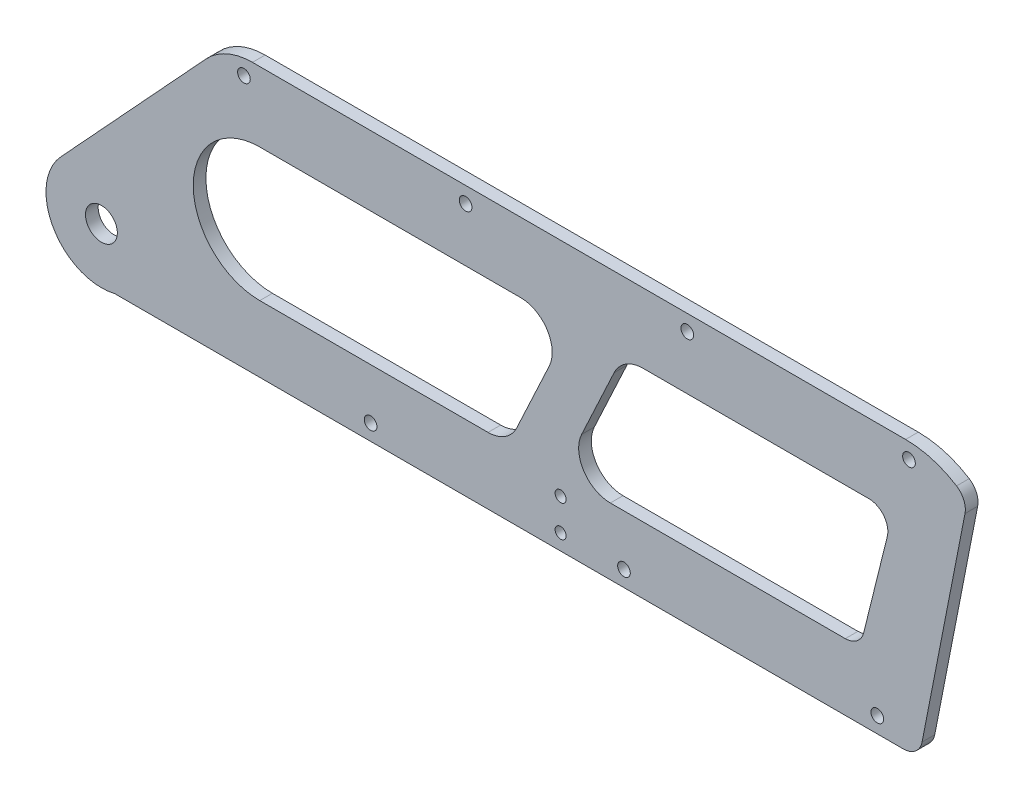
ISO-10303-21;
HEADER;
FILE_DESCRIPTION(('STEP AP214'),'2;1');
FILE_NAME('part.step','',(''),(''),'','','');
FILE_SCHEMA(('AUTOMOTIVE_DESIGN { 1 0 10303 214 1 1 1 1 }'));
ENDSEC;
DATA;
#1=APPLICATION_CONTEXT('core data for automotive mechanical design processes');
#2=APPLICATION_PROTOCOL_DEFINITION('international standard','automotive_design',2000,#1);
#3=PRODUCT_CONTEXT('',#1,'mechanical');
#4=PRODUCT('Part','Part','',(#3));
#5=PRODUCT_RELATED_PRODUCT_CATEGORY('part','',(#4));
#6=PRODUCT_DEFINITION_FORMATION('','',#4);
#7=PRODUCT_DEFINITION_CONTEXT('part definition',#1,'design');
#8=PRODUCT_DEFINITION('design','',#6,#7);
#9=PRODUCT_DEFINITION_SHAPE('','',#8);
#10=(LENGTH_UNIT() NAMED_UNIT(*) SI_UNIT(.MILLI.,.METRE.));
#11=(NAMED_UNIT(*) PLANE_ANGLE_UNIT() SI_UNIT($,.RADIAN.));
#12=(NAMED_UNIT(*) SI_UNIT($,.STERADIAN.) SOLID_ANGLE_UNIT());
#13=UNCERTAINTY_MEASURE_WITH_UNIT(LENGTH_MEASURE(1.E-05),#10,'distance_accuracy_value','');
#14=(GEOMETRIC_REPRESENTATION_CONTEXT(3) GLOBAL_UNCERTAINTY_ASSIGNED_CONTEXT((#13)) GLOBAL_UNIT_ASSIGNED_CONTEXT((#10,
#11,#12)) REPRESENTATION_CONTEXT('',''));
#15=CARTESIAN_POINT('',(0.,0.,0.));
#16=DIRECTION('',(0.,0.,1.));
#17=DIRECTION('',(1.,0.,0.));
#18=AXIS2_PLACEMENT_3D('',#15,#16,#17);
#19=CARTESIAN_POINT('',(-56.7504214600217,-11.,4.));
#20=DIRECTION('',(0.,0.,1.));
#21=DIRECTION('',(1.,0.,0.));
#22=AXIS2_PLACEMENT_3D('',#19,#20,#21);
#23=PLANE('',#22);
#24=CARTESIAN_POINT('',(-165.,-1.99999999999999,4.));
#25=DIRECTION('',(0.,0.,1.));
#26=DIRECTION('',(1.,0.,0.));
#27=AXIS2_PLACEMENT_3D('',#24,#25,#26);
#28=CIRCLE('',#27,1.75);
#29=CARTESIAN_POINT('',(-163.25,-1.99999999999999,4.));
#30=VERTEX_POINT('',#29);
#31=EDGE_CURVE('E355',#30,#30,#28,.T.);
#32=ORIENTED_EDGE('',*,*,#31,.F.);
#33=EDGE_LOOP('',(#32));
#34=FACE_BOUND('',#33,.T.);
#35=CARTESIAN_POINT('',(-125.,63.,4.));
#36=DIRECTION('',(0.,0.,1.));
#37=DIRECTION('',(1.,0.,0.));
#38=AXIS2_PLACEMENT_3D('',#35,#36,#37);
#39=CIRCLE('',#38,2.);
#40=CARTESIAN_POINT('',(-123.,63.,4.));
#41=VERTEX_POINT('',#40);
#42=EDGE_CURVE('E371',#41,#41,#39,.T.);
#43=ORIENTED_EDGE('',*,*,#42,.F.);
#44=EDGE_LOOP('',(#43));
#45=FACE_BOUND('',#44,.T.);
#46=CARTESIAN_POINT('',(-65.,-12.,4.));
#47=DIRECTION('',(0.,0.,1.));
#48=DIRECTION('',(1.,0.,0.));
#49=AXIS2_PLACEMENT_3D('',#46,#47,#48);
#50=CIRCLE('',#49,2.);
#51=CARTESIAN_POINT('',(-63.,-12.,4.));
#52=VERTEX_POINT('',#51);
#53=EDGE_CURVE('E387',#52,#52,#50,.T.);
#54=ORIENTED_EDGE('',*,*,#53,.F.);
#55=EDGE_LOOP('',(#54));
#56=FACE_BOUND('',#55,.T.);
#57=CARTESIAN_POINT('',(-265.,62.9999999999998,4.));
#58=DIRECTION('',(0.,0.,1.));
#59=DIRECTION('',(1.,0.,0.));
#60=AXIS2_PLACEMENT_3D('',#57,#58,#59);
#61=CIRCLE('',#60,2.);
#62=CARTESIAN_POINT('',(-263.,62.9999999999998,4.));
#63=VERTEX_POINT('',#62);
#64=EDGE_CURVE('E403',#63,#63,#61,.T.);
#65=ORIENTED_EDGE('',*,*,#64,.F.);
#66=EDGE_LOOP('',(#65));
#67=FACE_BOUND('',#66,.T.);
#68=CARTESIAN_POINT('',(-55.,63.,4.));
#69=DIRECTION('',(0.,0.,1.));
#70=DIRECTION('',(1.,0.,0.));
#71=AXIS2_PLACEMENT_3D('',#68,#69,#70);
#72=CIRCLE('',#71,2.);
#73=CARTESIAN_POINT('',(-53.,63.,4.));
#74=VERTEX_POINT('',#73);
#75=EDGE_CURVE('E419',#74,#74,#72,.T.);
#76=ORIENTED_EDGE('',*,*,#75,.F.);
#77=EDGE_LOOP('',(#76));
#78=FACE_BOUND('',#77,.T.);
#79=CARTESIAN_POINT('',(-56.7504214600217,-11.,4.));
#80=DIRECTION('',(0.,0.,1.));
#81=DIRECTION('',(1.,0.,0.));
#82=AXIS2_PLACEMENT_3D('',#79,#80,#81);
#83=CIRCLE('',#82,6.);
#84=CARTESIAN_POINT('',(-56.7504214600217,-17.,4.));
#85=VERTEX_POINT('',#84);
#86=CARTESIAN_POINT('',(-50.8620679911387,-12.1520822129922,4.));
#87=VERTEX_POINT('',#86);
#88=EDGE_CURVE('E427',#85,#87,#83,.T.);
#89=ORIENTED_EDGE('',*,*,#88,.T.);
#90=DIRECTION('',(0.192013702165376,0.981392244813839,0.));
#91=VECTOR('',#90,1.);
#92=CARTESIAN_POINT('',(-50.8620679911387,-12.1520822129922,4.));
#93=LINE('',#92,#91);
#94=CARTESIAN_POINT('',(-37.310871287128,57.1088049179109,4.));
#95=VERTEX_POINT('',#94);
#96=EDGE_CURVE('E431',#87,#95,#93,.T.);
#97=ORIENTED_EDGE('',*,*,#96,.T.);
#98=CARTESIAN_POINT('',(-43.199224756011,58.2608871309032,4.));
#99=DIRECTION('',(0.,0.,1.));
#100=DIRECTION('',(1.,0.,0.));
#101=AXIS2_PLACEMENT_3D('',#98,#99,#100);
#102=CIRCLE('',#101,6.);
#103=CARTESIAN_POINT('',(-39.9830891413641,63.326108913629,4.));
#104=VERTEX_POINT('',#103);
#105=EDGE_CURVE('E435',#95,#104,#102,.T.);
#106=ORIENTED_EDGE('',*,*,#105,.T.);
#107=CARTESIAN_POINT('',(-56.0637672145985,38.0000000000002,4.));
#108=DIRECTION('',(0.,0.,1.));
#109=DIRECTION('',(1.,0.,0.));
#110=AXIS2_PLACEMENT_3D('',#107,#108,#109);
#111=CIRCLE('',#110,29.9999999999998);
#112=CARTESIAN_POINT('',(-56.0637672145986,68.,4.));
#113=VERTEX_POINT('',#112);
#114=EDGE_CURVE('E438',#104,#113,#111,.T.);
#115=ORIENTED_EDGE('',*,*,#114,.T.);
#116=DIRECTION('',(-1.,0.,0.));
#117=VECTOR('',#116,1.);
#118=CARTESIAN_POINT('',(-262.305181407775,68.,4.));
#119=LINE('',#118,#117);
#120=CARTESIAN_POINT('',(-262.305181407775,68.,4.));
#121=VERTEX_POINT('',#120);
#122=EDGE_CURVE('E441',#113,#121,#119,.T.);
#123=ORIENTED_EDGE('',*,*,#122,.T.);
#124=CARTESIAN_POINT('',(-262.305181407775,48.0000000000001,4.));
#125=DIRECTION('',(0.,0.,1.));
#126=DIRECTION('',(1.,0.,0.));
#127=AXIS2_PLACEMENT_3D('',#124,#125,#126);
#128=CIRCLE('',#127,19.9999999999999);
#129=CARTESIAN_POINT('',(-277.003482508711,61.5631834296464,4.));
#130=VERTEX_POINT('',#129);
#131=EDGE_CURVE('E444',#121,#130,#128,.T.);
#132=ORIENTED_EDGE('',*,*,#131,.T.);
#133=DIRECTION('',(-0.678159171482318,-0.734915055046783,0.));
#134=VECTOR('',#133,1.);
#135=CARTESIAN_POINT('',(-322.861013463319,11.8677855009406,4.));
#136=LINE('',#135,#134);
#137=CARTESIAN_POINT('',(-322.861013463319,11.8677855009406,4.));
#138=VERTEX_POINT('',#137);
#139=EDGE_CURVE('E447',#130,#138,#136,.T.);
#140=ORIENTED_EDGE('',*,*,#139,.T.);
#141=CARTESIAN_POINT('',(-310.,0.,4.));
#142=DIRECTION('',(0.,0.,1.));
#143=DIRECTION('',(1.,0.,0.));
#144=AXIS2_PLACEMENT_3D('',#141,#142,#143);
#145=CIRCLE('',#144,17.5000000000001);
#146=CARTESIAN_POINT('',(-305.846688068541,-17.,4.));
#147=VERTEX_POINT('',#146);
#148=EDGE_CURVE('E450',#138,#147,#145,.T.);
#149=ORIENTED_EDGE('',*,*,#148,.T.);
#150=DIRECTION('',(1.,0.,0.));
#151=VECTOR('',#150,1.);
#152=CARTESIAN_POINT('',(-56.7504214600217,-17.,4.));
#153=LINE('',#152,#151);
#154=EDGE_CURVE('E453',#147,#85,#153,.T.);
#155=ORIENTED_EDGE('',*,*,#154,.T.);
#156=EDGE_LOOP('',(#89,#97,#106,#115,#123,#132,#140,#149,#155));
#157=FACE_BOUND('',#156,.T.);
#158=CARTESIAN_POINT('',(-195.,63.,4.));
#159=DIRECTION('',(0.,0.,1.));
#160=DIRECTION('',(1.,0.,0.));
#161=AXIS2_PLACEMENT_3D('',#158,#159,#160);
#162=CIRCLE('',#161,2.);
#163=CARTESIAN_POINT('',(-193.,63.,4.));
#164=VERTEX_POINT('',#163);
#165=EDGE_CURVE('E411',#164,#164,#162,.T.);
#166=ORIENTED_EDGE('',*,*,#165,.F.);
#167=EDGE_LOOP('',(#166));
#168=FACE_BOUND('',#167,.T.);
#169=CARTESIAN_POINT('',(-225.,-12.,4.));
#170=DIRECTION('',(0.,0.,1.));
#171=DIRECTION('',(1.,0.,0.));
#172=AXIS2_PLACEMENT_3D('',#169,#170,#171);
#173=CIRCLE('',#172,2.);
#174=CARTESIAN_POINT('',(-223.,-12.,4.));
#175=VERTEX_POINT('',#174);
#176=EDGE_CURVE('E395',#175,#175,#173,.T.);
#177=ORIENTED_EDGE('',*,*,#176,.F.);
#178=EDGE_LOOP('',(#177));
#179=FACE_BOUND('',#178,.T.);
#180=CARTESIAN_POINT('',(-310.,0.,4.));
#181=DIRECTION('',(0.,0.,1.));
#182=DIRECTION('',(1.,0.,0.));
#183=AXIS2_PLACEMENT_3D('',#180,#181,#182);
#184=CIRCLE('',#183,5.02999999999999);
#185=CARTESIAN_POINT('',(-304.97,0.,4.));
#186=VERTEX_POINT('',#185);
#187=EDGE_CURVE('E379',#186,#186,#184,.T.);
#188=ORIENTED_EDGE('',*,*,#187,.F.);
#189=EDGE_LOOP('',(#188));
#190=FACE_BOUND('',#189,.T.);
#191=CARTESIAN_POINT('',(-145.,-12.,4.));
#192=DIRECTION('',(0.,0.,1.));
#193=DIRECTION('',(1.,0.,0.));
#194=AXIS2_PLACEMENT_3D('',#191,#192,#193);
#195=CIRCLE('',#194,2.);
#196=CARTESIAN_POINT('',(-143.,-12.,4.));
#197=VERTEX_POINT('',#196);
#198=EDGE_CURVE('E363',#197,#197,#195,.T.);
#199=ORIENTED_EDGE('',*,*,#198,.F.);
#200=EDGE_LOOP('',(#199));
#201=FACE_BOUND('',#200,.T.);
#202=CARTESIAN_POINT('',(-165.,-12.,4.));
#203=DIRECTION('',(0.,0.,1.));
#204=DIRECTION('',(1.,0.,0.));
#205=AXIS2_PLACEMENT_3D('',#202,#203,#204);
#206=CIRCLE('',#205,1.75);
#207=CARTESIAN_POINT('',(-163.25,-12.,4.));
#208=VERTEX_POINT('',#207);
#209=EDGE_CURVE('E347',#208,#208,#206,.T.);
#210=ORIENTED_EDGE('',*,*,#209,.F.);
#211=EDGE_LOOP('',(#210));
#212=FACE_BOUND('',#211,.T.);
#213=DIRECTION('',(-1.,0.,0.));
#214=VECTOR('',#213,1.);
#215=CARTESIAN_POINT('',(-67.6704953234544,46.,4.));
#216=LINE('',#215,#214);
#217=CARTESIAN_POINT('',(-67.6704953234544,46.,4.));
#218=VERTEX_POINT('',#217);
#219=CARTESIAN_POINT('',(-139.044375749415,46.,4.));
#220=VERTEX_POINT('',#219);
#221=EDGE_CURVE('E267',#218,#220,#216,.T.);
#222=ORIENTED_EDGE('',*,*,#221,.F.);
#223=CARTESIAN_POINT('',(-67.6704953234544,40.,4.));
#224=DIRECTION('',(0.,0.,1.));
#225=DIRECTION('',(1.,0.,0.));
#226=AXIS2_PLACEMENT_3D('',#223,#224,#225);
#227=CIRCLE('',#226,6.);
#228=CARTESIAN_POINT('',(-61.8470447323598,38.5552082457736,4.));
#229=VERTEX_POINT('',#228);
#230=EDGE_CURVE('E264',#229,#218,#227,.T.);
#231=ORIENTED_EDGE('',*,*,#230,.F.);
#232=DIRECTION('',(0.240798625704396,0.970575098515758,0.));
#233=VECTOR('',#232,1.);
#234=CARTESIAN_POINT('',(-61.8470447323598,38.5552082457736,4.));
#235=LINE('',#234,#233);
#236=CARTESIAN_POINT('',(-69.2900120845812,8.55520824577364,4.));
#237=VERTEX_POINT('',#236);
#238=EDGE_CURVE('E287',#237,#229,#235,.T.);
#239=ORIENTED_EDGE('',*,*,#238,.F.);
#240=CARTESIAN_POINT('',(-75.1134626756758,9.99999999999999,4.));
#241=DIRECTION('',(0.,0.,1.));
#242=DIRECTION('',(-1.,0.,0.));
#243=AXIS2_PLACEMENT_3D('',#240,#241,#242);
#244=CIRCLE('',#243,6.);
#245=CARTESIAN_POINT('',(-75.1134626756758,3.99999999999999,4.));
#246=VERTEX_POINT('',#245);
#247=EDGE_CURVE('E283',#246,#237,#244,.T.);
#248=ORIENTED_EDGE('',*,*,#247,.F.);
#249=DIRECTION('',(1.,0.,0.));
#250=VECTOR('',#249,1.);
#251=CARTESIAN_POINT('',(-149.303144228825,3.99999999999999,4.));
#252=LINE('',#251,#250);
#253=CARTESIAN_POINT('',(-149.303144228825,3.99999999999999,4.));
#254=VERTEX_POINT('',#253);
#255=EDGE_CURVE('E280',#254,#246,#252,.T.);
#256=ORIENTED_EDGE('',*,*,#255,.F.);
#257=CARTESIAN_POINT('',(-149.303144228825,13.9999999999999,4.));
#258=DIRECTION('',(0.,0.,1.));
#259=DIRECTION('',(1.,0.,0.));
#260=AXIS2_PLACEMENT_3D('',#257,#258,#259);
#261=CIRCLE('',#260,9.99999999999996);
#262=CARTESIAN_POINT('',(-158.366222099191,18.2261826174071,4.));
#263=VERTEX_POINT('',#262);
#264=EDGE_CURVE('E277',#263,#254,#261,.T.);
#265=ORIENTED_EDGE('',*,*,#264,.F.);
#266=DIRECTION('',(-0.422618261740704,-0.906307787036648,0.));
#267=VECTOR('',#266,1.);
#268=CARTESIAN_POINT('',(-148.107453619781,40.226182617407,4.));
#269=LINE('',#268,#267);
#270=CARTESIAN_POINT('',(-148.107453619781,40.226182617407,4.));
#271=VERTEX_POINT('',#270);
#272=EDGE_CURVE('E274',#271,#263,#269,.T.);
#273=ORIENTED_EDGE('',*,*,#272,.F.);
#274=CARTESIAN_POINT('',(-139.044375749415,36.,4.));
#275=DIRECTION('',(0.,0.,1.));
#276=DIRECTION('',(1.,0.,0.));
#277=AXIS2_PLACEMENT_3D('',#274,#275,#276);
#278=CIRCLE('',#277,9.99999999999997);
#279=EDGE_CURVE('E271',#220,#271,#278,.T.);
#280=ORIENTED_EDGE('',*,*,#279,.F.);
#281=EDGE_LOOP('',(#222,#231,#239,#248,#256,#265,#273,#280));
#282=FACE_BOUND('',#281,.T.);
#283=DIRECTION('',(0.422618261740704,0.906307787036648,0.));
#284=VECTOR('',#283,1.);
#285=CARTESIAN_POINT('',(-178.858293522146,9.77381738259322,4.));
#286=LINE('',#285,#284);
#287=CARTESIAN_POINT('',(-178.858293522146,9.77381738259322,4.));
#288=VERTEX_POINT('',#287);
#289=CARTESIAN_POINT('',(-168.599525042736,31.7738173825929,4.));
#290=VERTEX_POINT('',#289);
#291=EDGE_CURVE('E204',#288,#290,#286,.T.);
#292=ORIENTED_EDGE('',*,*,#291,.F.);
#293=CARTESIAN_POINT('',(-187.921371392512,14.,4.));
#294=DIRECTION('',(0.,0.,1.));
#295=DIRECTION('',(1.,0.,0.));
#296=AXIS2_PLACEMENT_3D('',#293,#294,#295);
#297=CIRCLE('',#296,10.);
#298=CARTESIAN_POINT('',(-187.921371392512,3.99999999999998,4.));
#299=VERTEX_POINT('',#298);
#300=EDGE_CURVE('E195',#299,#288,#297,.T.);
#301=ORIENTED_EDGE('',*,*,#300,.F.);
#302=DIRECTION('',(1.,0.,0.));
#303=VECTOR('',#302,1.);
#304=CARTESIAN_POINT('',(-260.,3.99999999999998,4.));
#305=LINE('',#304,#303);
#306=CARTESIAN_POINT('',(-260.,3.99999999999998,4.));
#307=VERTEX_POINT('',#306);
#308=EDGE_CURVE('E230',#307,#299,#305,.T.);
#309=ORIENTED_EDGE('',*,*,#308,.F.);
#310=CARTESIAN_POINT('',(-260.,25.,4.));
#311=DIRECTION('',(0.,0.,1.));
#312=DIRECTION('',(1.,0.,0.));
#313=AXIS2_PLACEMENT_3D('',#310,#311,#312);
#314=CIRCLE('',#313,21.);
#315=CARTESIAN_POINT('',(-260.,46.,4.));
#316=VERTEX_POINT('',#315);
#317=EDGE_CURVE('E227',#316,#307,#314,.T.);
#318=ORIENTED_EDGE('',*,*,#317,.F.);
#319=DIRECTION('',(-1.,0.,0.));
#320=VECTOR('',#319,1.);
#321=CARTESIAN_POINT('',(-177.662602913102,46.,4.));
#322=LINE('',#321,#320);
#323=CARTESIAN_POINT('',(-177.662602913102,46.,4.));
#324=VERTEX_POINT('',#323);
#325=EDGE_CURVE('E222',#324,#316,#322,.T.);
#326=ORIENTED_EDGE('',*,*,#325,.F.);
#327=CARTESIAN_POINT('',(-177.662602913102,36.,4.));
#328=DIRECTION('',(0.,0.,1.));
#329=DIRECTION('',(1.,0.,0.));
#330=AXIS2_PLACEMENT_3D('',#327,#328,#329);
#331=CIRCLE('',#330,10.);
#332=EDGE_CURVE('E218',#290,#324,#331,.T.);
#333=ORIENTED_EDGE('',*,*,#332,.F.);
#334=EDGE_LOOP('',(#292,#301,#309,#318,#326,#333));
#335=FACE_BOUND('',#334,.T.);
#336=ADVANCED_FACE('F39',(#34,#45,#56,#67,#78,#157,#168,#179,#190,#201,#212,#282,#335),#23,.T.);
#337=CARTESIAN_POINT('',(-56.7504214600217,-11.,0.));
#338=DIRECTION('',(0.,0.,1.));
#339=DIRECTION('',(1.,0.,0.));
#340=AXIS2_PLACEMENT_3D('',#337,#338,#339);
#341=PLANE('',#340);
#342=CARTESIAN_POINT('',(-67.6704953234544,40.,0.));
#343=DIRECTION('',(0.,0.,1.));
#344=DIRECTION('',(1.,0.,0.));
#345=AXIS2_PLACEMENT_3D('',#342,#343,#344);
#346=CIRCLE('',#345,6.);
#347=CARTESIAN_POINT('',(-61.8470447323598,38.5552082457736,0.));
#348=VERTEX_POINT('',#347);
#349=CARTESIAN_POINT('',(-67.6704953234544,46.,0.));
#350=VERTEX_POINT('',#349);
#351=EDGE_CURVE('E213',#348,#350,#346,.T.);
#352=ORIENTED_EDGE('',*,*,#351,.T.);
#353=DIRECTION('',(-1.,0.,0.));
#354=VECTOR('',#353,1.);
#355=CARTESIAN_POINT('',(-67.6704953234544,46.,0.));
#356=LINE('',#355,#354);
#357=CARTESIAN_POINT('',(-139.044375749415,46.,0.));
#358=VERTEX_POINT('',#357);
#359=EDGE_CURVE('E294',#350,#358,#356,.T.);
#360=ORIENTED_EDGE('',*,*,#359,.T.);
#361=CARTESIAN_POINT('',(-139.044375749415,36.,0.));
#362=DIRECTION('',(0.,0.,1.));
#363=DIRECTION('',(1.,0.,0.));
#364=AXIS2_PLACEMENT_3D('',#361,#362,#363);
#365=CIRCLE('',#364,9.99999999999997);
#366=CARTESIAN_POINT('',(-148.107453619781,40.226182617407,0.));
#367=VERTEX_POINT('',#366);
#368=EDGE_CURVE('E298',#358,#367,#365,.T.);
#369=ORIENTED_EDGE('',*,*,#368,.T.);
#370=DIRECTION('',(-0.422618261740704,-0.906307787036648,0.));
#371=VECTOR('',#370,1.);
#372=CARTESIAN_POINT('',(-148.107453619781,40.226182617407,0.));
#373=LINE('',#372,#371);
#374=CARTESIAN_POINT('',(-158.366222099191,18.2261826174071,0.));
#375=VERTEX_POINT('',#374);
#376=EDGE_CURVE('E302',#367,#375,#373,.T.);
#377=ORIENTED_EDGE('',*,*,#376,.T.);
#378=CARTESIAN_POINT('',(-149.303144228825,13.9999999999999,0.));
#379=DIRECTION('',(0.,0.,1.));
#380=DIRECTION('',(1.,0.,0.));
#381=AXIS2_PLACEMENT_3D('',#378,#379,#380);
#382=CIRCLE('',#381,9.99999999999996);
#383=CARTESIAN_POINT('',(-149.303144228825,3.99999999999999,0.));
#384=VERTEX_POINT('',#383);
#385=EDGE_CURVE('E306',#375,#384,#382,.T.);
#386=ORIENTED_EDGE('',*,*,#385,.T.);
#387=DIRECTION('',(1.,0.,0.));
#388=VECTOR('',#387,1.);
#389=CARTESIAN_POINT('',(-149.303144228825,3.99999999999999,0.));
#390=LINE('',#389,#388);
#391=CARTESIAN_POINT('',(-75.1134626756758,3.99999999999999,0.));
#392=VERTEX_POINT('',#391);
#393=EDGE_CURVE('E310',#384,#392,#390,.T.);
#394=ORIENTED_EDGE('',*,*,#393,.T.);
#395=CARTESIAN_POINT('',(-75.1134626756758,9.99999999999999,0.));
#396=DIRECTION('',(0.,0.,1.));
#397=DIRECTION('',(-1.,0.,0.));
#398=AXIS2_PLACEMENT_3D('',#395,#396,#397);
#399=CIRCLE('',#398,6.);
#400=CARTESIAN_POINT('',(-69.2900120845812,8.55520824577364,0.));
#401=VERTEX_POINT('',#400);
#402=EDGE_CURVE('E314',#392,#401,#399,.T.);
#403=ORIENTED_EDGE('',*,*,#402,.T.);
#404=DIRECTION('',(0.240798625704396,0.970575098515758,0.));
#405=VECTOR('',#404,1.);
#406=CARTESIAN_POINT('',(-61.8470447323598,38.5552082457736,0.));
#407=LINE('',#406,#405);
#408=EDGE_CURVE('E268',#401,#348,#407,.T.);
#409=ORIENTED_EDGE('',*,*,#408,.T.);
#410=EDGE_LOOP('',(#352,#360,#369,#377,#386,#394,#403,#409));
#411=FACE_BOUND('',#410,.T.);
#412=CARTESIAN_POINT('',(-56.7504214600217,-11.,0.));
#413=DIRECTION('',(0.,0.,1.));
#414=DIRECTION('',(1.,0.,0.));
#415=AXIS2_PLACEMENT_3D('',#412,#413,#414);
#416=CIRCLE('',#415,6.);
#417=CARTESIAN_POINT('',(-56.7504214600217,-17.,0.));
#418=VERTEX_POINT('',#417);
#419=CARTESIAN_POINT('',(-50.8620679911387,-12.1520822129922,0.));
#420=VERTEX_POINT('',#419);
#421=EDGE_CURVE('E423',#418,#420,#416,.T.);
#422=ORIENTED_EDGE('',*,*,#421,.F.);
#423=DIRECTION('',(1.,0.,0.));
#424=VECTOR('',#423,1.);
#425=CARTESIAN_POINT('',(-56.7504214600217,-17.,0.));
#426=LINE('',#425,#424);
#427=CARTESIAN_POINT('',(-305.846688068541,-17.,0.));
#428=VERTEX_POINT('',#427);
#429=EDGE_CURVE('E432',#428,#418,#426,.T.);
#430=ORIENTED_EDGE('',*,*,#429,.F.);
#431=CARTESIAN_POINT('',(-310.,0.,0.));
#432=DIRECTION('',(0.,0.,1.));
#433=DIRECTION('',(1.,0.,0.));
#434=AXIS2_PLACEMENT_3D('',#431,#432,#433);
#435=CIRCLE('',#434,17.5000000000001);
#436=CARTESIAN_POINT('',(-322.861013463319,11.8677855009406,0.));
#437=VERTEX_POINT('',#436);
#438=EDGE_CURVE('E478',#437,#428,#435,.T.);
#439=ORIENTED_EDGE('',*,*,#438,.F.);
#440=DIRECTION('',(-0.678159171482318,-0.734915055046783,0.));
#441=VECTOR('',#440,1.);
#442=CARTESIAN_POINT('',(-322.861013463319,11.8677855009406,0.));
#443=LINE('',#442,#441);
#444=CARTESIAN_POINT('',(-277.003482508711,61.5631834296464,0.));
#445=VERTEX_POINT('',#444);
#446=EDGE_CURVE('E475',#445,#437,#443,.T.);
#447=ORIENTED_EDGE('',*,*,#446,.F.);
#448=CARTESIAN_POINT('',(-262.305181407775,48.0000000000001,0.));
#449=DIRECTION('',(0.,0.,1.));
#450=DIRECTION('',(1.,0.,0.));
#451=AXIS2_PLACEMENT_3D('',#448,#449,#450);
#452=CIRCLE('',#451,19.9999999999999);
#453=CARTESIAN_POINT('',(-262.305181407775,68.,0.));
#454=VERTEX_POINT('',#453);
#455=EDGE_CURVE('E472',#454,#445,#452,.T.);
#456=ORIENTED_EDGE('',*,*,#455,.F.);
#457=DIRECTION('',(-1.,0.,0.));
#458=VECTOR('',#457,1.);
#459=CARTESIAN_POINT('',(-262.305181407775,68.,0.));
#460=LINE('',#459,#458);
#461=CARTESIAN_POINT('',(-56.0637672145986,68.,0.));
#462=VERTEX_POINT('',#461);
#463=EDGE_CURVE('E469',#462,#454,#460,.T.);
#464=ORIENTED_EDGE('',*,*,#463,.F.);
#465=CARTESIAN_POINT('',(-56.0637672145985,38.0000000000002,0.));
#466=DIRECTION('',(0.,0.,1.));
#467=DIRECTION('',(1.,0.,0.));
#468=AXIS2_PLACEMENT_3D('',#465,#466,#467);
#469=CIRCLE('',#468,29.9999999999998);
#470=CARTESIAN_POINT('',(-39.9830891413641,63.326108913629,0.));
#471=VERTEX_POINT('',#470);
#472=EDGE_CURVE('E466',#471,#462,#469,.T.);
#473=ORIENTED_EDGE('',*,*,#472,.F.);
#474=CARTESIAN_POINT('',(-43.199224756011,58.2608871309032,0.));
#475=DIRECTION('',(0.,0.,1.));
#476=DIRECTION('',(1.,0.,0.));
#477=AXIS2_PLACEMENT_3D('',#474,#475,#476);
#478=CIRCLE('',#477,6.);
#479=CARTESIAN_POINT('',(-37.310871287128,57.1088049179109,0.));
#480=VERTEX_POINT('',#479);
#481=EDGE_CURVE('E463',#480,#471,#478,.T.);
#482=ORIENTED_EDGE('',*,*,#481,.F.);
#483=DIRECTION('',(0.192013702165376,0.981392244813839,0.));
#484=VECTOR('',#483,1.);
#485=CARTESIAN_POINT('',(-50.8620679911387,-12.1520822129922,0.));
#486=LINE('',#485,#484);
#487=EDGE_CURVE('E460',#420,#480,#486,.T.);
#488=ORIENTED_EDGE('',*,*,#487,.F.);
#489=EDGE_LOOP('',(#422,#430,#439,#447,#456,#464,#473,#482,#488));
#490=FACE_BOUND('',#489,.T.);
#491=CARTESIAN_POINT('',(-55.,63.,0.));
#492=DIRECTION('',(0.,0.,1.));
#493=DIRECTION('',(1.,0.,0.));
#494=AXIS2_PLACEMENT_3D('',#491,#492,#493);
#495=CIRCLE('',#494,2.);
#496=CARTESIAN_POINT('',(-53.,63.,0.));
#497=VERTEX_POINT('',#496);
#498=EDGE_CURVE('E415',#497,#497,#495,.T.);
#499=ORIENTED_EDGE('',*,*,#498,.T.);
#500=EDGE_LOOP('',(#499));
#501=FACE_BOUND('',#500,.T.);
#502=CARTESIAN_POINT('',(-195.,63.,0.));
#503=DIRECTION('',(0.,0.,1.));
#504=DIRECTION('',(1.,0.,0.));
#505=AXIS2_PLACEMENT_3D('',#502,#503,#504);
#506=CIRCLE('',#505,2.);
#507=CARTESIAN_POINT('',(-193.,63.,0.));
#508=VERTEX_POINT('',#507);
#509=EDGE_CURVE('E407',#508,#508,#506,.T.);
#510=ORIENTED_EDGE('',*,*,#509,.T.);
#511=EDGE_LOOP('',(#510));
#512=FACE_BOUND('',#511,.T.);
#513=CARTESIAN_POINT('',(-265.,62.9999999999998,0.));
#514=DIRECTION('',(0.,0.,1.));
#515=DIRECTION('',(1.,0.,0.));
#516=AXIS2_PLACEMENT_3D('',#513,#514,#515);
#517=CIRCLE('',#516,2.);
#518=CARTESIAN_POINT('',(-263.,62.9999999999998,0.));
#519=VERTEX_POINT('',#518);
#520=EDGE_CURVE('E399',#519,#519,#517,.T.);
#521=ORIENTED_EDGE('',*,*,#520,.T.);
#522=EDGE_LOOP('',(#521));
#523=FACE_BOUND('',#522,.T.);
#524=CARTESIAN_POINT('',(-225.,-12.,0.));
#525=DIRECTION('',(0.,0.,1.));
#526=DIRECTION('',(1.,0.,0.));
#527=AXIS2_PLACEMENT_3D('',#524,#525,#526);
#528=CIRCLE('',#527,2.);
#529=CARTESIAN_POINT('',(-223.,-12.,0.));
#530=VERTEX_POINT('',#529);
#531=EDGE_CURVE('E391',#530,#530,#528,.T.);
#532=ORIENTED_EDGE('',*,*,#531,.T.);
#533=EDGE_LOOP('',(#532));
#534=FACE_BOUND('',#533,.T.);
#535=CARTESIAN_POINT('',(-65.,-12.,0.));
#536=DIRECTION('',(0.,0.,1.));
#537=DIRECTION('',(1.,0.,0.));
#538=AXIS2_PLACEMENT_3D('',#535,#536,#537);
#539=CIRCLE('',#538,2.);
#540=CARTESIAN_POINT('',(-63.,-12.,0.));
#541=VERTEX_POINT('',#540);
#542=EDGE_CURVE('E383',#541,#541,#539,.T.);
#543=ORIENTED_EDGE('',*,*,#542,.T.);
#544=EDGE_LOOP('',(#543));
#545=FACE_BOUND('',#544,.T.);
#546=CARTESIAN_POINT('',(-310.,0.,0.));
#547=DIRECTION('',(0.,0.,1.));
#548=DIRECTION('',(1.,0.,0.));
#549=AXIS2_PLACEMENT_3D('',#546,#547,#548);
#550=CIRCLE('',#549,5.02999999999999);
#551=CARTESIAN_POINT('',(-304.97,0.,0.));
#552=VERTEX_POINT('',#551);
#553=EDGE_CURVE('E375',#552,#552,#550,.T.);
#554=ORIENTED_EDGE('',*,*,#553,.T.);
#555=EDGE_LOOP('',(#554));
#556=FACE_BOUND('',#555,.T.);
#557=CARTESIAN_POINT('',(-125.,63.,0.));
#558=DIRECTION('',(0.,0.,1.));
#559=DIRECTION('',(1.,0.,0.));
#560=AXIS2_PLACEMENT_3D('',#557,#558,#559);
#561=CIRCLE('',#560,2.);
#562=CARTESIAN_POINT('',(-123.,63.,0.));
#563=VERTEX_POINT('',#562);
#564=EDGE_CURVE('E367',#563,#563,#561,.T.);
#565=ORIENTED_EDGE('',*,*,#564,.T.);
#566=EDGE_LOOP('',(#565));
#567=FACE_BOUND('',#566,.T.);
#568=CARTESIAN_POINT('',(-145.,-12.,0.));
#569=DIRECTION('',(0.,0.,1.));
#570=DIRECTION('',(1.,0.,0.));
#571=AXIS2_PLACEMENT_3D('',#568,#569,#570);
#572=CIRCLE('',#571,2.);
#573=CARTESIAN_POINT('',(-143.,-12.,0.));
#574=VERTEX_POINT('',#573);
#575=EDGE_CURVE('E359',#574,#574,#572,.T.);
#576=ORIENTED_EDGE('',*,*,#575,.T.);
#577=EDGE_LOOP('',(#576));
#578=FACE_BOUND('',#577,.T.);
#579=CARTESIAN_POINT('',(-165.,-1.99999999999999,0.));
#580=DIRECTION('',(0.,0.,1.));
#581=DIRECTION('',(1.,0.,0.));
#582=AXIS2_PLACEMENT_3D('',#579,#580,#581);
#583=CIRCLE('',#582,1.75);
#584=CARTESIAN_POINT('',(-163.25,-1.99999999999999,0.));
#585=VERTEX_POINT('',#584);
#586=EDGE_CURVE('E351',#585,#585,#583,.T.);
#587=ORIENTED_EDGE('',*,*,#586,.T.);
#588=EDGE_LOOP('',(#587));
#589=FACE_BOUND('',#588,.T.);
#590=CARTESIAN_POINT('',(-165.,-12.,0.));
#591=DIRECTION('',(0.,0.,1.));
#592=DIRECTION('',(1.,0.,0.));
#593=AXIS2_PLACEMENT_3D('',#590,#591,#592);
#594=CIRCLE('',#593,1.75);
#595=CARTESIAN_POINT('',(-163.25,-12.,0.));
#596=VERTEX_POINT('',#595);
#597=EDGE_CURVE('E346',#596,#596,#594,.T.);
#598=ORIENTED_EDGE('',*,*,#597,.T.);
#599=EDGE_LOOP('',(#598));
#600=FACE_BOUND('',#599,.T.);
#601=CARTESIAN_POINT('',(-187.921371392512,14.,0.));
#602=DIRECTION('',(0.,0.,1.));
#603=DIRECTION('',(1.,0.,0.));
#604=AXIS2_PLACEMENT_3D('',#601,#602,#603);
#605=CIRCLE('',#604,10.);
#606=CARTESIAN_POINT('',(-187.921371392512,3.99999999999998,0.));
#607=VERTEX_POINT('',#606);
#608=CARTESIAN_POINT('',(-178.858293522146,9.77381738259322,0.));
#609=VERTEX_POINT('',#608);
#610=EDGE_CURVE('E63',#607,#609,#605,.T.);
#611=ORIENTED_EDGE('',*,*,#610,.T.);
#612=DIRECTION('',(0.422618261740704,0.906307787036648,0.));
#613=VECTOR('',#612,1.);
#614=CARTESIAN_POINT('',(-178.858293522146,9.77381738259322,0.));
#615=LINE('',#614,#613);
#616=CARTESIAN_POINT('',(-168.599525042736,31.7738173825929,0.));
#617=VERTEX_POINT('',#616);
#618=EDGE_CURVE('E211',#609,#617,#615,.T.);
#619=ORIENTED_EDGE('',*,*,#618,.T.);
#620=CARTESIAN_POINT('',(-177.662602913102,36.,0.));
#621=DIRECTION('',(0.,0.,1.));
#622=DIRECTION('',(1.,0.,0.));
#623=AXIS2_PLACEMENT_3D('',#620,#621,#622);
#624=CIRCLE('',#623,10.);
#625=CARTESIAN_POINT('',(-177.662602913102,46.,0.));
#626=VERTEX_POINT('',#625);
#627=EDGE_CURVE('E237',#617,#626,#624,.T.);
#628=ORIENTED_EDGE('',*,*,#627,.T.);
#629=DIRECTION('',(-1.,0.,0.));
#630=VECTOR('',#629,1.);
#631=CARTESIAN_POINT('',(-177.662602913102,46.,0.));
#632=LINE('',#631,#630);
#633=CARTESIAN_POINT('',(-260.,46.,0.));
#634=VERTEX_POINT('',#633);
#635=EDGE_CURVE('E241',#626,#634,#632,.T.);
#636=ORIENTED_EDGE('',*,*,#635,.T.);
#637=CARTESIAN_POINT('',(-260.,25.,0.));
#638=DIRECTION('',(0.,0.,1.));
#639=DIRECTION('',(1.,0.,0.));
#640=AXIS2_PLACEMENT_3D('',#637,#638,#639);
#641=CIRCLE('',#640,21.);
#642=CARTESIAN_POINT('',(-260.,3.99999999999999,0.));
#643=VERTEX_POINT('',#642);
#644=EDGE_CURVE('E245',#634,#643,#641,.T.);
#645=ORIENTED_EDGE('',*,*,#644,.T.);
#646=DIRECTION('',(1.,0.,0.));
#647=VECTOR('',#646,1.);
#648=CARTESIAN_POINT('',(-260.,3.99999999999998,0.));
#649=LINE('',#648,#647);
#650=EDGE_CURVE('E205',#643,#607,#649,.T.);
#651=ORIENTED_EDGE('',*,*,#650,.T.);
#652=EDGE_LOOP('',(#611,#619,#628,#636,#645,#651));
#653=FACE_BOUND('',#652,.T.);
#654=ADVANCED_FACE('F521',(#411,#490,#501,#512,#523,#534,#545,#556,#567,#578,#589,#600,#653),
#341,.F.);
#655=CARTESIAN_POINT('',(-56.7504214600217,-11.,4.));
#656=DIRECTION('',(0.,0.,-1.));
#657=DIRECTION('',(-1.,0.,0.));
#658=AXIS2_PLACEMENT_3D('',#655,#656,#657);
#659=CYLINDRICAL_SURFACE('',#658,6.);
#660=ORIENTED_EDGE('',*,*,#421,.T.);
#661=DIRECTION('',(0.,0.,-1.));
#662=VECTOR('',#661,1.);
#663=CARTESIAN_POINT('',(-50.8620679911387,-12.1520822129922,4.));
#664=LINE('',#663,#662);
#665=EDGE_CURVE('E11',#87,#420,#664,.T.);
#666=ORIENTED_EDGE('',*,*,#665,.F.);
#667=ORIENTED_EDGE('',*,*,#88,.F.);
#668=DIRECTION('',(0.,0.,-1.));
#669=VECTOR('',#668,1.);
#670=CARTESIAN_POINT('',(-56.7504214600217,-17.,4.));
#671=LINE('',#670,#669);
#672=EDGE_CURVE('E456',#85,#418,#671,.T.);
#673=ORIENTED_EDGE('',*,*,#672,.T.);
#674=EDGE_LOOP('',(#660,#666,#667,#673));
#675=FACE_BOUND('',#674,.T.);
#676=ADVANCED_FACE('F41',(#675),#659,.T.);
#677=CARTESIAN_POINT('',(-50.8620679911387,-12.1520822129922,4.));
#678=DIRECTION('',(-0.981392244813839,0.192013702165376,0.));
#679=DIRECTION('',(-0.192013702165376,-0.981392244813839,0.));
#680=AXIS2_PLACEMENT_3D('',#677,#678,#679);
#681=PLANE('',#680);
#682=ORIENTED_EDGE('',*,*,#487,.T.);
#683=DIRECTION('',(0.,0.,-1.));
#684=VECTOR('',#683,1.);
#685=CARTESIAN_POINT('',(-37.310871287128,57.1088049179109,4.));
#686=LINE('',#685,#684);
#687=EDGE_CURVE('E48',#95,#480,#686,.T.);
#688=ORIENTED_EDGE('',*,*,#687,.F.);
#689=ORIENTED_EDGE('',*,*,#96,.F.);
#690=ORIENTED_EDGE('',*,*,#665,.T.);
#691=EDGE_LOOP('',(#682,#688,#689,#690));
#692=FACE_BOUND('',#691,.T.);
#693=ADVANCED_FACE('F539',(#692),#681,.F.);
#694=CARTESIAN_POINT('',(-43.199224756011,58.2608871309032,4.));
#695=DIRECTION('',(0.,0.,-1.));
#696=DIRECTION('',(-1.,0.,0.));
#697=AXIS2_PLACEMENT_3D('',#694,#695,#696);
#698=CYLINDRICAL_SURFACE('',#697,6.);
#699=ORIENTED_EDGE('',*,*,#481,.T.);
#700=DIRECTION('',(0.,0.,-1.));
#701=VECTOR('',#700,1.);
#702=CARTESIAN_POINT('',(-39.9830891413641,63.326108913629,4.));
#703=LINE('',#702,#701);
#704=EDGE_CURVE('E506',#104,#471,#703,.T.);
#705=ORIENTED_EDGE('',*,*,#704,.F.);
#706=ORIENTED_EDGE('',*,*,#105,.F.);
#707=ORIENTED_EDGE('',*,*,#687,.T.);
#708=EDGE_LOOP('',(#699,#705,#706,#707));
#709=FACE_BOUND('',#708,.T.);
#710=ADVANCED_FACE('F515',(#709),#698,.T.);
#711=CARTESIAN_POINT('',(-56.0637672145985,38.0000000000002,4.));
#712=DIRECTION('',(0.,0.,-1.));
#713=DIRECTION('',(-1.,0.,0.));
#714=AXIS2_PLACEMENT_3D('',#711,#712,#713);
#715=CYLINDRICAL_SURFACE('',#714,29.9999999999998);
#716=ORIENTED_EDGE('',*,*,#472,.T.);
#717=DIRECTION('',(0.,0.,-1.));
#718=VECTOR('',#717,1.);
#719=CARTESIAN_POINT('',(-56.0637672145986,68.,4.));
#720=LINE('',#719,#718);
#721=EDGE_CURVE('E502',#113,#462,#720,.T.);
#722=ORIENTED_EDGE('',*,*,#721,.F.);
#723=ORIENTED_EDGE('',*,*,#114,.F.);
#724=ORIENTED_EDGE('',*,*,#704,.T.);
#725=EDGE_LOOP('',(#716,#722,#723,#724));
#726=FACE_BOUND('',#725,.T.);
#727=ADVANCED_FACE('F527',(#726),#715,.T.);
#728=CARTESIAN_POINT('',(-262.305181407775,68.,4.));
#729=DIRECTION('',(0.,-1.,0.));
#730=DIRECTION('',(1.,0.,0.));
#731=AXIS2_PLACEMENT_3D('',#728,#729,#730);
#732=PLANE('',#731);
#733=ORIENTED_EDGE('',*,*,#463,.T.);
#734=DIRECTION('',(0.,0.,-1.));
#735=VECTOR('',#734,1.);
#736=CARTESIAN_POINT('',(-262.305181407775,68.,4.));
#737=LINE('',#736,#735);
#738=EDGE_CURVE('E498',#121,#454,#737,.T.);
#739=ORIENTED_EDGE('',*,*,#738,.F.);
#740=ORIENTED_EDGE('',*,*,#122,.F.);
#741=ORIENTED_EDGE('',*,*,#721,.T.);
#742=EDGE_LOOP('',(#733,#739,#740,#741));
#743=FACE_BOUND('',#742,.T.);
#744=ADVANCED_FACE('F531',(#743),#732,.F.);
#745=CARTESIAN_POINT('',(-262.305181407775,48.0000000000001,4.));
#746=DIRECTION('',(0.,0.,-1.));
#747=DIRECTION('',(-1.,0.,0.));
#748=AXIS2_PLACEMENT_3D('',#745,#746,#747);
#749=CYLINDRICAL_SURFACE('',#748,19.9999999999999);
#750=ORIENTED_EDGE('',*,*,#455,.T.);
#751=DIRECTION('',(0.,0.,-1.));
#752=VECTOR('',#751,1.);
#753=CARTESIAN_POINT('',(-277.003482508711,61.5631834296464,4.));
#754=LINE('',#753,#752);
#755=EDGE_CURVE('E494',#130,#445,#754,.T.);
#756=ORIENTED_EDGE('',*,*,#755,.F.);
#757=ORIENTED_EDGE('',*,*,#131,.F.);
#758=ORIENTED_EDGE('',*,*,#738,.T.);
#759=EDGE_LOOP('',(#750,#756,#757,#758));
#760=FACE_BOUND('',#759,.T.);
#761=ADVANCED_FACE('F557',(#760),#749,.T.);
#762=CARTESIAN_POINT('',(-322.861013463319,11.8677855009406,4.));
#763=DIRECTION('',(0.734915055046783,-0.678159171482318,0.));
#764=DIRECTION('',(0.678159171482318,0.734915055046783,0.));
#765=AXIS2_PLACEMENT_3D('',#762,#763,#764);
#766=PLANE('',#765);
#767=ORIENTED_EDGE('',*,*,#446,.T.);
#768=DIRECTION('',(0.,0.,-1.));
#769=VECTOR('',#768,1.);
#770=CARTESIAN_POINT('',(-322.861013463319,11.8677855009406,4.));
#771=LINE('',#770,#769);
#772=EDGE_CURVE('E490',#138,#437,#771,.T.);
#773=ORIENTED_EDGE('',*,*,#772,.F.);
#774=ORIENTED_EDGE('',*,*,#139,.F.);
#775=ORIENTED_EDGE('',*,*,#755,.T.);
#776=EDGE_LOOP('',(#767,#773,#774,#775));
#777=FACE_BOUND('',#776,.T.);
#778=ADVANCED_FACE('F555',(#777),#766,.F.);
#779=CARTESIAN_POINT('',(-310.,0.,4.));
#780=DIRECTION('',(0.,0.,-1.));
#781=DIRECTION('',(-1.,0.,0.));
#782=AXIS2_PLACEMENT_3D('',#779,#780,#781);
#783=CYLINDRICAL_SURFACE('',#782,17.5000000000001);
#784=ORIENTED_EDGE('',*,*,#438,.T.);
#785=DIRECTION('',(0.,0.,-1.));
#786=VECTOR('',#785,1.);
#787=CARTESIAN_POINT('',(-305.846688068541,-17.,4.));
#788=LINE('',#787,#786);
#789=EDGE_CURVE('E486',#147,#428,#788,.T.);
#790=ORIENTED_EDGE('',*,*,#789,.F.);
#791=ORIENTED_EDGE('',*,*,#148,.F.);
#792=ORIENTED_EDGE('',*,*,#772,.T.);
#793=EDGE_LOOP('',(#784,#790,#791,#792));
#794=FACE_BOUND('',#793,.T.);
#795=ADVANCED_FACE('F551',(#794),#783,.T.);
#796=CARTESIAN_POINT('',(-56.7504214600217,-17.,4.));
#797=DIRECTION('',(0.,1.,0.));
#798=DIRECTION('',(-1.,0.,0.));
#799=AXIS2_PLACEMENT_3D('',#796,#797,#798);
#800=PLANE('',#799);
#801=ORIENTED_EDGE('',*,*,#429,.T.);
#802=ORIENTED_EDGE('',*,*,#672,.F.);
#803=ORIENTED_EDGE('',*,*,#154,.F.);
#804=ORIENTED_EDGE('',*,*,#789,.T.);
#805=EDGE_LOOP('',(#801,#802,#803,#804));
#806=FACE_BOUND('',#805,.T.);
#807=ADVANCED_FACE('F546',(#806),#800,.F.);
#808=CARTESIAN_POINT('',(-55.,63.,4.));
#809=DIRECTION('',(0.,0.,-1.));
#810=DIRECTION('',(-1.,0.,0.));
#811=AXIS2_PLACEMENT_3D('',#808,#809,#810);
#812=CYLINDRICAL_SURFACE('',#811,2.);
#813=ORIENTED_EDGE('',*,*,#75,.T.);
#814=EDGE_LOOP('',(#813));
#815=FACE_BOUND('',#814,.T.);
#816=ORIENTED_EDGE('',*,*,#498,.F.);
#817=EDGE_LOOP('',(#816));
#818=FACE_BOUND('',#817,.T.);
#819=ADVANCED_FACE('F577',(#815,#818),#812,.F.);
#820=CARTESIAN_POINT('',(-195.,63.,4.));
#821=DIRECTION('',(0.,0.,-1.));
#822=DIRECTION('',(-1.,0.,0.));
#823=AXIS2_PLACEMENT_3D('',#820,#821,#822);
#824=CYLINDRICAL_SURFACE('',#823,2.);
#825=ORIENTED_EDGE('',*,*,#165,.T.);
#826=EDGE_LOOP('',(#825));
#827=FACE_BOUND('',#826,.T.);
#828=ORIENTED_EDGE('',*,*,#509,.F.);
#829=EDGE_LOOP('',(#828));
#830=FACE_BOUND('',#829,.T.);
#831=ADVANCED_FACE('F597',(#827,#830),#824,.F.);
#832=CARTESIAN_POINT('',(-265.,62.9999999999998,4.));
#833=DIRECTION('',(0.,0.,-1.));
#834=DIRECTION('',(-1.,0.,0.));
#835=AXIS2_PLACEMENT_3D('',#832,#833,#834);
#836=CYLINDRICAL_SURFACE('',#835,2.);
#837=ORIENTED_EDGE('',*,*,#64,.T.);
#838=EDGE_LOOP('',(#837));
#839=FACE_BOUND('',#838,.T.);
#840=ORIENTED_EDGE('',*,*,#520,.F.);
#841=EDGE_LOOP('',(#840));
#842=FACE_BOUND('',#841,.T.);
#843=ADVANCED_FACE('F604',(#839,#842),#836,.F.);
#844=CARTESIAN_POINT('',(-225.,-12.,4.));
#845=DIRECTION('',(0.,0.,-1.));
#846=DIRECTION('',(-1.,0.,0.));
#847=AXIS2_PLACEMENT_3D('',#844,#845,#846);
#848=CYLINDRICAL_SURFACE('',#847,2.);
#849=ORIENTED_EDGE('',*,*,#176,.T.);
#850=EDGE_LOOP('',(#849));
#851=FACE_BOUND('',#850,.T.);
#852=ORIENTED_EDGE('',*,*,#531,.F.);
#853=EDGE_LOOP('',(#852));
#854=FACE_BOUND('',#853,.T.);
#855=ADVANCED_FACE('F611',(#851,#854),#848,.F.);
#856=CARTESIAN_POINT('',(-65.,-12.,4.));
#857=DIRECTION('',(0.,0.,-1.));
#858=DIRECTION('',(-1.,0.,0.));
#859=AXIS2_PLACEMENT_3D('',#856,#857,#858);
#860=CYLINDRICAL_SURFACE('',#859,2.);
#861=ORIENTED_EDGE('',*,*,#53,.T.);
#862=EDGE_LOOP('',(#861));
#863=FACE_BOUND('',#862,.T.);
#864=ORIENTED_EDGE('',*,*,#542,.F.);
#865=EDGE_LOOP('',(#864));
#866=FACE_BOUND('',#865,.T.);
#867=ADVANCED_FACE('F619',(#863,#866),#860,.F.);
#868=CARTESIAN_POINT('',(-310.,0.,4.));
#869=DIRECTION('',(0.,0.,-1.));
#870=DIRECTION('',(-1.,0.,0.));
#871=AXIS2_PLACEMENT_3D('',#868,#869,#870);
#872=CYLINDRICAL_SURFACE('',#871,5.02999999999999);
#873=ORIENTED_EDGE('',*,*,#187,.T.);
#874=EDGE_LOOP('',(#873));
#875=FACE_BOUND('',#874,.T.);
#876=ORIENTED_EDGE('',*,*,#553,.F.);
#877=EDGE_LOOP('',(#876));
#878=FACE_BOUND('',#877,.T.);
#879=ADVANCED_FACE('F627',(#875,#878),#872,.F.);
#880=CARTESIAN_POINT('',(-125.,63.,4.));
#881=DIRECTION('',(0.,0.,-1.));
#882=DIRECTION('',(-1.,0.,0.));
#883=AXIS2_PLACEMENT_3D('',#880,#881,#882);
#884=CYLINDRICAL_SURFACE('',#883,2.);
#885=ORIENTED_EDGE('',*,*,#42,.T.);
#886=EDGE_LOOP('',(#885));
#887=FACE_BOUND('',#886,.T.);
#888=ORIENTED_EDGE('',*,*,#564,.F.);
#889=EDGE_LOOP('',(#888));
#890=FACE_BOUND('',#889,.T.);
#891=ADVANCED_FACE('F635',(#887,#890),#884,.F.);
#892=CARTESIAN_POINT('',(-145.,-12.,4.));
#893=DIRECTION('',(0.,0.,-1.));
#894=DIRECTION('',(-1.,0.,0.));
#895=AXIS2_PLACEMENT_3D('',#892,#893,#894);
#896=CYLINDRICAL_SURFACE('',#895,2.);
#897=ORIENTED_EDGE('',*,*,#198,.T.);
#898=EDGE_LOOP('',(#897));
#899=FACE_BOUND('',#898,.T.);
#900=ORIENTED_EDGE('',*,*,#575,.F.);
#901=EDGE_LOOP('',(#900));
#902=FACE_BOUND('',#901,.T.);
#903=ADVANCED_FACE('F643',(#899,#902),#896,.F.);
#904=CARTESIAN_POINT('',(-165.,-1.99999999999999,4.));
#905=DIRECTION('',(0.,0.,-1.));
#906=DIRECTION('',(-1.,0.,0.));
#907=AXIS2_PLACEMENT_3D('',#904,#905,#906);
#908=CYLINDRICAL_SURFACE('',#907,1.75);
#909=ORIENTED_EDGE('',*,*,#31,.T.);
#910=EDGE_LOOP('',(#909));
#911=FACE_BOUND('',#910,.T.);
#912=ORIENTED_EDGE('',*,*,#586,.F.);
#913=EDGE_LOOP('',(#912));
#914=FACE_BOUND('',#913,.T.);
#915=ADVANCED_FACE('F651',(#911,#914),#908,.F.);
#916=CARTESIAN_POINT('',(-165.,-12.,4.));
#917=DIRECTION('',(0.,0.,-1.));
#918=DIRECTION('',(-1.,0.,0.));
#919=AXIS2_PLACEMENT_3D('',#916,#917,#918);
#920=CYLINDRICAL_SURFACE('',#919,1.75);
#921=ORIENTED_EDGE('',*,*,#209,.T.);
#922=EDGE_LOOP('',(#921));
#923=FACE_BOUND('',#922,.T.);
#924=ORIENTED_EDGE('',*,*,#597,.F.);
#925=EDGE_LOOP('',(#924));
#926=FACE_BOUND('',#925,.T.);
#927=ADVANCED_FACE('F659',(#923,#926),#920,.F.);
#928=CARTESIAN_POINT('',(-67.6704953234544,40.,4.));
#929=DIRECTION('',(0.,0.,-1.));
#930=DIRECTION('',(-1.,0.,0.));
#931=AXIS2_PLACEMENT_3D('',#928,#929,#930);
#932=CYLINDRICAL_SURFACE('',#931,6.);
#933=ORIENTED_EDGE('',*,*,#351,.F.);
#934=DIRECTION('',(0.,0.,-1.));
#935=VECTOR('',#934,1.);
#936=CARTESIAN_POINT('',(-61.8470447323598,38.5552082457736,4.));
#937=LINE('',#936,#935);
#938=EDGE_CURVE('E290',#229,#348,#937,.T.);
#939=ORIENTED_EDGE('',*,*,#938,.F.);
#940=ORIENTED_EDGE('',*,*,#230,.T.);
#941=DIRECTION('',(0.,0.,-1.));
#942=VECTOR('',#941,1.);
#943=CARTESIAN_POINT('',(-67.6704953234544,46.,4.));
#944=LINE('',#943,#942);
#945=EDGE_CURVE('E342',#218,#350,#944,.T.);
#946=ORIENTED_EDGE('',*,*,#945,.T.);
#947=EDGE_LOOP('',(#933,#939,#940,#946));
#948=FACE_BOUND('',#947,.T.);
#949=ADVANCED_FACE('F667',(#948),#932,.F.);
#950=CARTESIAN_POINT('',(-67.6704953234544,46.,4.));
#951=DIRECTION('',(0.,-1.,0.));
#952=DIRECTION('',(1.,0.,0.));
#953=AXIS2_PLACEMENT_3D('',#950,#951,#952);
#954=PLANE('',#953);
#955=ORIENTED_EDGE('',*,*,#359,.F.);
#956=ORIENTED_EDGE('',*,*,#945,.F.);
#957=ORIENTED_EDGE('',*,*,#221,.T.);
#958=DIRECTION('',(0.,0.,-1.));
#959=VECTOR('',#958,1.);
#960=CARTESIAN_POINT('',(-139.044375749415,46.,4.));
#961=LINE('',#960,#959);
#962=EDGE_CURVE('E339',#220,#358,#961,.T.);
#963=ORIENTED_EDGE('',*,*,#962,.T.);
#964=EDGE_LOOP('',(#955,#956,#957,#963));
#965=FACE_BOUND('',#964,.T.);
#966=ADVANCED_FACE('F675',(#965),#954,.T.);
#967=CARTESIAN_POINT('',(-139.044375749415,36.,4.));
#968=DIRECTION('',(0.,0.,-1.));
#969=DIRECTION('',(-1.,0.,0.));
#970=AXIS2_PLACEMENT_3D('',#967,#968,#969);
#971=CYLINDRICAL_SURFACE('',#970,9.99999999999997);
#972=ORIENTED_EDGE('',*,*,#368,.F.);
#973=ORIENTED_EDGE('',*,*,#962,.F.);
#974=ORIENTED_EDGE('',*,*,#279,.T.);
#975=DIRECTION('',(0.,0.,-1.));
#976=VECTOR('',#975,1.);
#977=CARTESIAN_POINT('',(-148.107453619781,40.226182617407,4.));
#978=LINE('',#977,#976);
#979=EDGE_CURVE('E336',#271,#367,#978,.T.);
#980=ORIENTED_EDGE('',*,*,#979,.T.);
#981=EDGE_LOOP('',(#972,#973,#974,#980));
#982=FACE_BOUND('',#981,.T.);
#983=ADVANCED_FACE('F683',(#982),#971,.F.);
#984=CARTESIAN_POINT('',(-148.107453619781,40.226182617407,4.));
#985=DIRECTION('',(0.906307787036648,-0.422618261740704,0.));
#986=DIRECTION('',(0.422618261740704,0.906307787036648,0.));
#987=AXIS2_PLACEMENT_3D('',#984,#985,#986);
#988=PLANE('',#987);
#989=ORIENTED_EDGE('',*,*,#376,.F.);
#990=ORIENTED_EDGE('',*,*,#979,.F.);
#991=ORIENTED_EDGE('',*,*,#272,.T.);
#992=DIRECTION('',(0.,0.,-1.));
#993=VECTOR('',#992,1.);
#994=CARTESIAN_POINT('',(-158.366222099191,18.2261826174071,4.));
#995=LINE('',#994,#993);
#996=EDGE_CURVE('E333',#263,#375,#995,.T.);
#997=ORIENTED_EDGE('',*,*,#996,.T.);
#998=EDGE_LOOP('',(#989,#990,#991,#997));
#999=FACE_BOUND('',#998,.T.);
#1000=ADVANCED_FACE('F691',(#999),#988,.T.);
#1001=CARTESIAN_POINT('',(-149.303144228825,13.9999999999999,4.));
#1002=DIRECTION('',(0.,0.,-1.));
#1003=DIRECTION('',(-1.,0.,0.));
#1004=AXIS2_PLACEMENT_3D('',#1001,#1002,#1003);
#1005=CYLINDRICAL_SURFACE('',#1004,9.99999999999996);
#1006=ORIENTED_EDGE('',*,*,#385,.F.);
#1007=ORIENTED_EDGE('',*,*,#996,.F.);
#1008=ORIENTED_EDGE('',*,*,#264,.T.);
#1009=DIRECTION('',(0.,0.,-1.));
#1010=VECTOR('',#1009,1.);
#1011=CARTESIAN_POINT('',(-149.303144228825,3.99999999999999,4.));
#1012=LINE('',#1011,#1010);
#1013=EDGE_CURVE('E330',#254,#384,#1012,.T.);
#1014=ORIENTED_EDGE('',*,*,#1013,.T.);
#1015=EDGE_LOOP('',(#1006,#1007,#1008,#1014));
#1016=FACE_BOUND('',#1015,.T.);
#1017=ADVANCED_FACE('F699',(#1016),#1005,.F.);
#1018=CARTESIAN_POINT('',(-149.303144228825,3.99999999999999,4.));
#1019=DIRECTION('',(0.,1.,0.));
#1020=DIRECTION('',(-1.,0.,0.));
#1021=AXIS2_PLACEMENT_3D('',#1018,#1019,#1020);
#1022=PLANE('',#1021);
#1023=ORIENTED_EDGE('',*,*,#393,.F.);
#1024=ORIENTED_EDGE('',*,*,#1013,.F.);
#1025=ORIENTED_EDGE('',*,*,#255,.T.);
#1026=DIRECTION('',(0.,0.,-1.));
#1027=VECTOR('',#1026,1.);
#1028=CARTESIAN_POINT('',(-75.1134626756758,3.99999999999999,4.));
#1029=LINE('',#1028,#1027);
#1030=EDGE_CURVE('E327',#246,#392,#1029,.T.);
#1031=ORIENTED_EDGE('',*,*,#1030,.T.);
#1032=EDGE_LOOP('',(#1023,#1024,#1025,#1031));
#1033=FACE_BOUND('',#1032,.T.);
#1034=ADVANCED_FACE('F707',(#1033),#1022,.T.);
#1035=CARTESIAN_POINT('',(-75.1134626756758,9.99999999999999,4.));
#1036=DIRECTION('',(0.,0.,-1.));
#1037=DIRECTION('',(-1.,0.,0.));
#1038=AXIS2_PLACEMENT_3D('',#1035,#1036,#1037);
#1039=CYLINDRICAL_SURFACE('',#1038,6.);
#1040=ORIENTED_EDGE('',*,*,#402,.F.);
#1041=ORIENTED_EDGE('',*,*,#1030,.F.);
#1042=ORIENTED_EDGE('',*,*,#247,.T.);
#1043=DIRECTION('',(0.,0.,-1.));
#1044=VECTOR('',#1043,1.);
#1045=CARTESIAN_POINT('',(-69.2900120845812,8.55520824577364,4.));
#1046=LINE('',#1045,#1044);
#1047=EDGE_CURVE('E324',#237,#401,#1046,.T.);
#1048=ORIENTED_EDGE('',*,*,#1047,.T.);
#1049=EDGE_LOOP('',(#1040,#1041,#1042,#1048));
#1050=FACE_BOUND('',#1049,.T.);
#1051=ADVANCED_FACE('F715',(#1050),#1039,.F.);
#1052=CARTESIAN_POINT('',(-61.8470447323598,38.5552082457736,4.));
#1053=DIRECTION('',(-0.970575098515759,0.240798625704396,0.));
#1054=DIRECTION('',(-0.240798625704396,-0.970575098515759,0.));
#1055=AXIS2_PLACEMENT_3D('',#1052,#1053,#1054);
#1056=PLANE('',#1055);
#1057=ORIENTED_EDGE('',*,*,#408,.F.);
#1058=ORIENTED_EDGE('',*,*,#1047,.F.);
#1059=ORIENTED_EDGE('',*,*,#238,.T.);
#1060=ORIENTED_EDGE('',*,*,#938,.T.);
#1061=EDGE_LOOP('',(#1057,#1058,#1059,#1060));
#1062=FACE_BOUND('',#1061,.T.);
#1063=ADVANCED_FACE('F723',(#1062),#1056,.T.);
#1064=CARTESIAN_POINT('',(-187.921371392512,14.,4.));
#1065=DIRECTION('',(0.,0.,-1.));
#1066=DIRECTION('',(-1.,0.,0.));
#1067=AXIS2_PLACEMENT_3D('',#1064,#1065,#1066);
#1068=CYLINDRICAL_SURFACE('',#1067,10.);
#1069=ORIENTED_EDGE('',*,*,#610,.F.);
#1070=DIRECTION('',(0.,0.,-1.));
#1071=VECTOR('',#1070,1.);
#1072=CARTESIAN_POINT('',(-187.921371392512,3.99999999999998,4.));
#1073=LINE('',#1072,#1071);
#1074=EDGE_CURVE('E199',#299,#607,#1073,.T.);
#1075=ORIENTED_EDGE('',*,*,#1074,.F.);
#1076=ORIENTED_EDGE('',*,*,#300,.T.);
#1077=DIRECTION('',(0.,0.,-1.));
#1078=VECTOR('',#1077,1.);
#1079=CARTESIAN_POINT('',(-178.858293522146,9.77381738259322,4.));
#1080=LINE('',#1079,#1078);
#1081=EDGE_CURVE('E198',#288,#609,#1080,.T.);
#1082=ORIENTED_EDGE('',*,*,#1081,.T.);
#1083=EDGE_LOOP('',(#1069,#1075,#1076,#1082));
#1084=FACE_BOUND('',#1083,.T.);
#1085=ADVANCED_FACE('F197',(#1084),#1068,.F.);
#1086=CARTESIAN_POINT('',(-178.858293522146,9.77381738259322,4.));
#1087=DIRECTION('',(-0.906307787036648,0.422618261740704,0.));
#1088=DIRECTION('',(-0.422618261740704,-0.906307787036648,0.));
#1089=AXIS2_PLACEMENT_3D('',#1086,#1087,#1088);
#1090=PLANE('',#1089);
#1091=ORIENTED_EDGE('',*,*,#618,.F.);
#1092=ORIENTED_EDGE('',*,*,#1081,.F.);
#1093=ORIENTED_EDGE('',*,*,#291,.T.);
#1094=DIRECTION('',(0.,0.,-1.));
#1095=VECTOR('',#1094,1.);
#1096=CARTESIAN_POINT('',(-168.599525042736,31.7738173825929,4.));
#1097=LINE('',#1096,#1095);
#1098=EDGE_CURVE('E214',#290,#617,#1097,.T.);
#1099=ORIENTED_EDGE('',*,*,#1098,.T.);
#1100=EDGE_LOOP('',(#1091,#1092,#1093,#1099));
#1101=FACE_BOUND('',#1100,.T.);
#1102=ADVANCED_FACE('F208',(#1101),#1090,.T.);
#1103=CARTESIAN_POINT('',(-177.662602913102,36.,4.));
#1104=DIRECTION('',(0.,0.,-1.));
#1105=DIRECTION('',(-1.,0.,0.));
#1106=AXIS2_PLACEMENT_3D('',#1103,#1104,#1105);
#1107=CYLINDRICAL_SURFACE('',#1106,10.);
#1108=ORIENTED_EDGE('',*,*,#627,.F.);
#1109=ORIENTED_EDGE('',*,*,#1098,.F.);
#1110=ORIENTED_EDGE('',*,*,#332,.T.);
#1111=DIRECTION('',(0.,0.,-1.));
#1112=VECTOR('',#1111,1.);
#1113=CARTESIAN_POINT('',(-177.662602913102,46.,4.));
#1114=LINE('',#1113,#1112);
#1115=EDGE_CURVE('E259',#324,#626,#1114,.T.);
#1116=ORIENTED_EDGE('',*,*,#1115,.T.);
#1117=EDGE_LOOP('',(#1108,#1109,#1110,#1116));
#1118=FACE_BOUND('',#1117,.T.);
#1119=ADVANCED_FACE('F744',(#1118),#1107,.F.);
#1120=CARTESIAN_POINT('',(-177.662602913102,46.,4.));
#1121=DIRECTION('',(0.,-1.,0.));
#1122=DIRECTION('',(1.,0.,0.));
#1123=AXIS2_PLACEMENT_3D('',#1120,#1121,#1122);
#1124=PLANE('',#1123);
#1125=ORIENTED_EDGE('',*,*,#635,.F.);
#1126=ORIENTED_EDGE('',*,*,#1115,.F.);
#1127=ORIENTED_EDGE('',*,*,#325,.T.);
#1128=DIRECTION('',(0.,0.,-1.));
#1129=VECTOR('',#1128,1.);
#1130=CARTESIAN_POINT('',(-260.,46.,4.));
#1131=LINE('',#1130,#1129);
#1132=EDGE_CURVE('E256',#316,#634,#1131,.T.);
#1133=ORIENTED_EDGE('',*,*,#1132,.T.);
#1134=EDGE_LOOP('',(#1125,#1126,#1127,#1133));
#1135=FACE_BOUND('',#1134,.T.);
#1136=ADVANCED_FACE('F751',(#1135),#1124,.T.);
#1137=CARTESIAN_POINT('',(-260.,25.,4.));
#1138=DIRECTION('',(0.,0.,-1.));
#1139=DIRECTION('',(-1.,0.,0.));
#1140=AXIS2_PLACEMENT_3D('',#1137,#1138,#1139);
#1141=CYLINDRICAL_SURFACE('',#1140,21.);
#1142=ORIENTED_EDGE('',*,*,#644,.F.);
#1143=ORIENTED_EDGE('',*,*,#1132,.F.);
#1144=ORIENTED_EDGE('',*,*,#317,.T.);
#1145=DIRECTION('',(0.,0.,-1.));
#1146=VECTOR('',#1145,1.);
#1147=CARTESIAN_POINT('',(-260.,3.99999999999999,4.));
#1148=LINE('',#1147,#1146);
#1149=EDGE_CURVE('E55',#307,#643,#1148,.T.);
#1150=ORIENTED_EDGE('',*,*,#1149,.T.);
#1151=EDGE_LOOP('',(#1142,#1143,#1144,#1150));
#1152=FACE_BOUND('',#1151,.T.);
#1153=ADVANCED_FACE('F759',(#1152),#1141,.F.);
#1154=CARTESIAN_POINT('',(-260.,3.99999999999998,4.));
#1155=DIRECTION('',(0.,1.,0.));
#1156=DIRECTION('',(0.,0.,1.));
#1157=AXIS2_PLACEMENT_3D('',#1154,#1155,#1156);
#1158=PLANE('',#1157);
#1159=ORIENTED_EDGE('',*,*,#650,.F.);
#1160=ORIENTED_EDGE('',*,*,#1149,.F.);
#1161=ORIENTED_EDGE('',*,*,#308,.T.);
#1162=ORIENTED_EDGE('',*,*,#1074,.T.);
#1163=EDGE_LOOP('',(#1159,#1160,#1161,#1162));
#1164=FACE_BOUND('',#1163,.T.);
#1165=ADVANCED_FACE('F767',(#1164),#1158,.T.);
#1166=CLOSED_SHELL('',(#336,#654,#676,#693,#710,#727,#744,#761,#778,#795,#807,#819,#831,#843,
#855,#867,#879,#891,#903,#915,#927,#949,#966,#983,#1000,#1017,#1034,#1051,#1063,#1085,#1102,
#1119,#1136,#1153,#1165));
#1167=MANIFOLD_SOLID_BREP('B2',#1166);
#1168=ADVANCED_BREP_SHAPE_REPRESENTATION('',(#18,#1167),#14);
#1169=SHAPE_DEFINITION_REPRESENTATION(#9,#1168);
ENDSEC;
END-ISO-10303-21;
